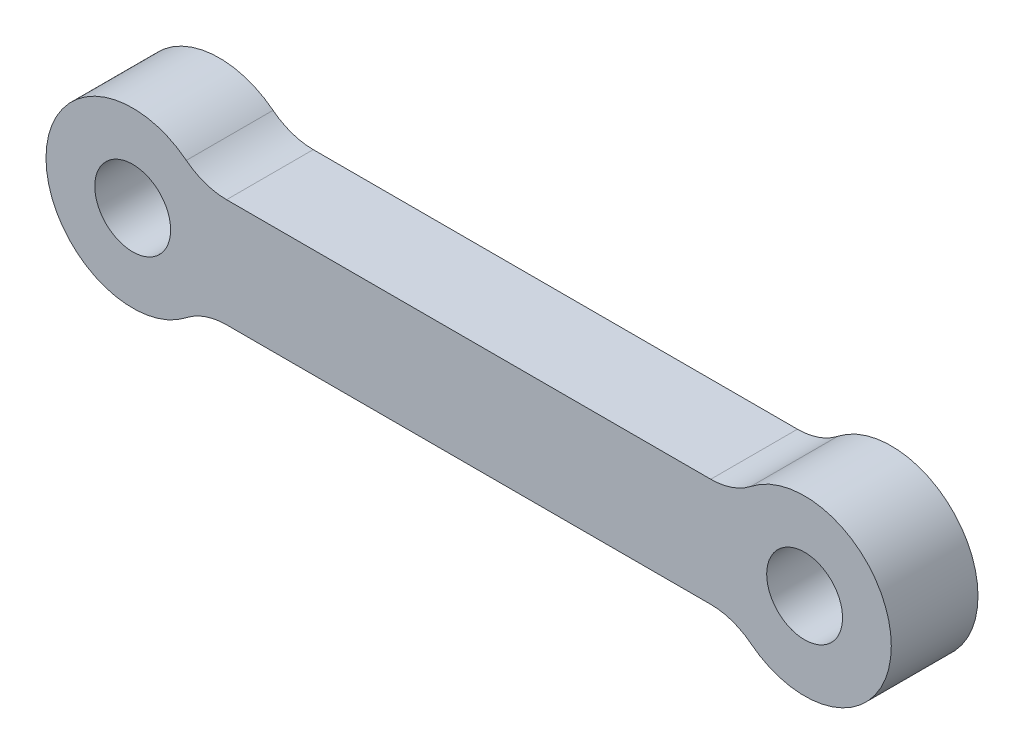
ISO-10303-21;
HEADER;
FILE_DESCRIPTION(('STEP AP214'),'2;1');
FILE_NAME('part.step','',(''),(''),'','','');
FILE_SCHEMA(('AUTOMOTIVE_DESIGN { 1 0 10303 214 1 1 1 1 }'));
ENDSEC;
DATA;
#1=APPLICATION_CONTEXT('core data for automotive mechanical design processes');
#2=APPLICATION_PROTOCOL_DEFINITION('international standard','automotive_design',2000,#1);
#3=PRODUCT_CONTEXT('',#1,'mechanical');
#4=PRODUCT('Part','Part','',(#3));
#5=PRODUCT_RELATED_PRODUCT_CATEGORY('part','',(#4));
#6=PRODUCT_DEFINITION_FORMATION('','',#4);
#7=PRODUCT_DEFINITION_CONTEXT('part definition',#1,'design');
#8=PRODUCT_DEFINITION('design','',#6,#7);
#9=PRODUCT_DEFINITION_SHAPE('','',#8);
#10=(LENGTH_UNIT() NAMED_UNIT(*) SI_UNIT(.MILLI.,.METRE.));
#11=(NAMED_UNIT(*) PLANE_ANGLE_UNIT() SI_UNIT($,.RADIAN.));
#12=(NAMED_UNIT(*) SI_UNIT($,.STERADIAN.) SOLID_ANGLE_UNIT());
#13=UNCERTAINTY_MEASURE_WITH_UNIT(LENGTH_MEASURE(1.E-05),#10,'distance_accuracy_value','');
#14=(GEOMETRIC_REPRESENTATION_CONTEXT(3) GLOBAL_UNCERTAINTY_ASSIGNED_CONTEXT((#13)) GLOBAL_UNIT_ASSIGNED_CONTEXT((#10,
#11,#12)) REPRESENTATION_CONTEXT('',''));
#15=CARTESIAN_POINT('',(0.,0.,0.));
#16=DIRECTION('',(0.,0.,1.));
#17=DIRECTION('',(1.,0.,0.));
#18=AXIS2_PLACEMENT_3D('',#15,#16,#17);
#19=CARTESIAN_POINT('',(31.,0.,4.));
#20=DIRECTION('',(0.,0.,-1.));
#21=DIRECTION('',(-1.,0.,0.));
#22=AXIS2_PLACEMENT_3D('',#19,#20,#21);
#23=PLANE('',#22);
#24=DIRECTION('',(1.,0.,0.));
#25=VECTOR('',#24,1.);
#26=CARTESIAN_POINT('',(27.8775047361113,-2.50000466539417,4.));
#27=LINE('',#26,#25);
#28=CARTESIAN_POINT('',(4.33012109306915,-2.50000466539417,4.));
#29=VERTEX_POINT('',#28);
#30=CARTESIAN_POINT('',(26.6698789069308,-2.50000466539417,4.));
#31=VERTEX_POINT('',#30);
#32=EDGE_CURVE('E136',#29,#31,#27,.T.);
#33=ORIENTED_EDGE('',*,*,#32,.T.);
#34=CARTESIAN_POINT('',(26.6698789069308,-5.50000466539417,4.));
#35=DIRECTION('',(0.,0.,-1.));
#36=DIRECTION('',(-1.,0.,0.));
#37=AXIS2_PLACEMENT_3D('',#34,#35,#36);
#38=CIRCLE('',#37,3.);
#39=CARTESIAN_POINT('',(28.5256450896748,-3.14285980879667,4.));
#40=VERTEX_POINT('',#39);
#41=EDGE_CURVE('E153',#31,#40,#38,.T.);
#42=ORIENTED_EDGE('',*,*,#41,.T.);
#43=CARTESIAN_POINT('',(31.,0.,4.));
#44=DIRECTION('',(0.,0.,1.));
#45=DIRECTION('',(-1.,0.,0.));
#46=AXIS2_PLACEMENT_3D('',#43,#44,#45);
#47=CIRCLE('',#46,4.);
#48=CARTESIAN_POINT('',(28.5256450896748,3.14285980879667,4.));
#49=VERTEX_POINT('',#48);
#50=EDGE_CURVE('E135',#40,#49,#47,.T.);
#51=ORIENTED_EDGE('',*,*,#50,.T.);
#52=CARTESIAN_POINT('',(26.6698789069308,5.50000466539417,4.));
#53=DIRECTION('',(0.,0.,-1.));
#54=DIRECTION('',(-1.,0.,0.));
#55=AXIS2_PLACEMENT_3D('',#52,#53,#54);
#56=CIRCLE('',#55,3.);
#57=CARTESIAN_POINT('',(26.6698789069308,2.50000466539417,4.));
#58=VERTEX_POINT('',#57);
#59=EDGE_CURVE('E109',#49,#58,#56,.T.);
#60=ORIENTED_EDGE('',*,*,#59,.T.);
#61=DIRECTION('',(-1.,0.,0.));
#62=VECTOR('',#61,1.);
#63=CARTESIAN_POINT('',(3.12249526388871,2.50000466539417,4.));
#64=LINE('',#63,#62);
#65=CARTESIAN_POINT('',(4.33012109306916,2.50000466539417,4.));
#66=VERTEX_POINT('',#65);
#67=EDGE_CURVE('E117',#58,#66,#64,.T.);
#68=ORIENTED_EDGE('',*,*,#67,.T.);
#69=CARTESIAN_POINT('',(4.33012109306916,5.50000466539417,4.));
#70=DIRECTION('',(0.,0.,-1.));
#71=DIRECTION('',(-1.,0.,0.));
#72=AXIS2_PLACEMENT_3D('',#69,#70,#71);
#73=CIRCLE('',#72,3.);
#74=CARTESIAN_POINT('',(2.47435491032523,3.14285980879667,4.));
#75=VERTEX_POINT('',#74);
#76=EDGE_CURVE('E11',#66,#75,#73,.T.);
#77=ORIENTED_EDGE('',*,*,#76,.T.);
#78=CARTESIAN_POINT('',(0.,0.,4.));
#79=DIRECTION('',(0.,0.,1.));
#80=DIRECTION('',(1.,0.,0.));
#81=AXIS2_PLACEMENT_3D('',#78,#79,#80);
#82=CIRCLE('',#81,4.);
#83=CARTESIAN_POINT('',(2.47435491032523,-3.14285980879667,4.));
#84=VERTEX_POINT('',#83);
#85=EDGE_CURVE('E163',#75,#84,#82,.T.);
#86=ORIENTED_EDGE('',*,*,#85,.T.);
#87=CARTESIAN_POINT('',(4.33012109306915,-5.50000466539417,4.));
#88=DIRECTION('',(0.,0.,-1.));
#89=DIRECTION('',(-1.,0.,0.));
#90=AXIS2_PLACEMENT_3D('',#87,#88,#89);
#91=CIRCLE('',#90,3.);
#92=EDGE_CURVE('E157',#84,#29,#91,.T.);
#93=ORIENTED_EDGE('',*,*,#92,.T.);
#94=EDGE_LOOP('',(#33,#42,#51,#60,#68,#77,#86,#93));
#95=FACE_BOUND('',#94,.T.);
#96=CARTESIAN_POINT('',(31.,0.,4.));
#97=DIRECTION('',(0.,0.,1.));
#98=DIRECTION('',(-1.,0.,0.));
#99=AXIS2_PLACEMENT_3D('',#96,#97,#98);
#100=CIRCLE('',#99,1.75000024917156);
#101=CARTESIAN_POINT('',(29.2499997508284,0.,4.));
#102=VERTEX_POINT('',#101);
#103=EDGE_CURVE('E129',#102,#102,#100,.T.);
#104=ORIENTED_EDGE('',*,*,#103,.F.);
#105=EDGE_LOOP('',(#104));
#106=FACE_BOUND('',#105,.T.);
#107=CARTESIAN_POINT('',(0.,0.,4.));
#108=DIRECTION('',(0.,0.,1.));
#109=DIRECTION('',(1.,0.,0.));
#110=AXIS2_PLACEMENT_3D('',#107,#108,#109);
#111=CIRCLE('',#110,1.75000024917156);
#112=CARTESIAN_POINT('',(1.75000024917156,0.,4.));
#113=VERTEX_POINT('',#112);
#114=EDGE_CURVE('E182',#113,#113,#111,.T.);
#115=ORIENTED_EDGE('',*,*,#114,.F.);
#116=EDGE_LOOP('',(#115));
#117=FACE_BOUND('',#116,.T.);
#118=ADVANCED_FACE('F34',(#95,#106,#117),#23,.F.);
#119=CARTESIAN_POINT('',(31.,0.,0.));
#120=DIRECTION('',(0.,0.,-1.));
#121=DIRECTION('',(-1.,0.,0.));
#122=AXIS2_PLACEMENT_3D('',#119,#120,#121);
#123=PLANE('',#122);
#124=CARTESIAN_POINT('',(31.,0.,0.));
#125=DIRECTION('',(0.,0.,1.));
#126=DIRECTION('',(-1.,0.,0.));
#127=AXIS2_PLACEMENT_3D('',#124,#125,#126);
#128=CIRCLE('',#127,1.75000024917156);
#129=CARTESIAN_POINT('',(29.2499997508284,0.,0.));
#130=VERTEX_POINT('',#129);
#131=EDGE_CURVE('E179',#130,#130,#128,.T.);
#132=ORIENTED_EDGE('',*,*,#131,.T.);
#133=EDGE_LOOP('',(#132));
#134=FACE_BOUND('',#133,.T.);
#135=CARTESIAN_POINT('',(31.,0.,0.));
#136=DIRECTION('',(0.,0.,1.));
#137=DIRECTION('',(-1.,0.,0.));
#138=AXIS2_PLACEMENT_3D('',#135,#136,#137);
#139=CIRCLE('',#138,4.);
#140=CARTESIAN_POINT('',(28.5256450896748,-3.14285980879667,0.));
#141=VERTEX_POINT('',#140);
#142=CARTESIAN_POINT('',(28.5256450896748,3.14285980879667,0.));
#143=VERTEX_POINT('',#142);
#144=EDGE_CURVE('E125',#141,#143,#139,.T.);
#145=ORIENTED_EDGE('',*,*,#144,.F.);
#146=CARTESIAN_POINT('',(26.6698789069308,-5.50000466539417,0.));
#147=DIRECTION('',(0.,0.,-1.));
#148=DIRECTION('',(-1.,0.,0.));
#149=AXIS2_PLACEMENT_3D('',#146,#147,#148);
#150=CIRCLE('',#149,3.);
#151=CARTESIAN_POINT('',(26.6698789069308,-2.50000466539417,0.));
#152=VERTEX_POINT('',#151);
#153=EDGE_CURVE('E151',#141,#152,#150,.F.);
#154=ORIENTED_EDGE('',*,*,#153,.T.);
#155=DIRECTION('',(1.,0.,0.));
#156=VECTOR('',#155,1.);
#157=CARTESIAN_POINT('',(27.8775047361113,-2.50000466539417,0.));
#158=LINE('',#157,#156);
#159=CARTESIAN_POINT('',(4.33012109306915,-2.50000466539417,0.));
#160=VERTEX_POINT('',#159);
#161=EDGE_CURVE('E127',#160,#152,#158,.T.);
#162=ORIENTED_EDGE('',*,*,#161,.F.);
#163=CARTESIAN_POINT('',(4.33012109306915,-5.50000466539417,0.));
#164=DIRECTION('',(0.,0.,-1.));
#165=DIRECTION('',(-1.,0.,0.));
#166=AXIS2_PLACEMENT_3D('',#163,#164,#165);
#167=CIRCLE('',#166,3.);
#168=CARTESIAN_POINT('',(2.47435491032523,-3.14285980879667,0.));
#169=VERTEX_POINT('',#168);
#170=EDGE_CURVE('E155',#160,#169,#167,.F.);
#171=ORIENTED_EDGE('',*,*,#170,.T.);
#172=CARTESIAN_POINT('',(0.,0.,0.));
#173=DIRECTION('',(0.,0.,1.));
#174=DIRECTION('',(1.,0.,0.));
#175=AXIS2_PLACEMENT_3D('',#172,#173,#174);
#176=CIRCLE('',#175,4.);
#177=CARTESIAN_POINT('',(2.47435491032523,3.14285980879667,0.));
#178=VERTEX_POINT('',#177);
#179=EDGE_CURVE('E124',#178,#169,#176,.T.);
#180=ORIENTED_EDGE('',*,*,#179,.F.);
#181=CARTESIAN_POINT('',(4.33012109306916,5.50000466539417,0.));
#182=DIRECTION('',(0.,0.,-1.));
#183=DIRECTION('',(-1.,0.,0.));
#184=AXIS2_PLACEMENT_3D('',#181,#182,#183);
#185=CIRCLE('',#184,3.);
#186=CARTESIAN_POINT('',(4.33012109306916,2.50000466539417,0.));
#187=VERTEX_POINT('',#186);
#188=EDGE_CURVE('E42',#178,#187,#185,.F.);
#189=ORIENTED_EDGE('',*,*,#188,.T.);
#190=DIRECTION('',(-1.,0.,0.));
#191=VECTOR('',#190,1.);
#192=CARTESIAN_POINT('',(3.12249526388871,2.50000466539417,0.));
#193=LINE('',#192,#191);
#194=CARTESIAN_POINT('',(26.6698789069308,2.50000466539417,0.));
#195=VERTEX_POINT('',#194);
#196=EDGE_CURVE('E115',#195,#187,#193,.T.);
#197=ORIENTED_EDGE('',*,*,#196,.F.);
#198=CARTESIAN_POINT('',(26.6698789069308,5.50000466539417,0.));
#199=DIRECTION('',(0.,0.,-1.));
#200=DIRECTION('',(-1.,0.,0.));
#201=AXIS2_PLACEMENT_3D('',#198,#199,#200);
#202=CIRCLE('',#201,3.);
#203=EDGE_CURVE('E99',#195,#143,#202,.F.);
#204=ORIENTED_EDGE('',*,*,#203,.T.);
#205=EDGE_LOOP('',(#145,#154,#162,#171,#180,#189,#197,#204));
#206=FACE_BOUND('',#205,.T.);
#207=CARTESIAN_POINT('',(0.,0.,0.));
#208=DIRECTION('',(0.,0.,1.));
#209=DIRECTION('',(1.,0.,0.));
#210=AXIS2_PLACEMENT_3D('',#207,#208,#209);
#211=CIRCLE('',#210,1.75000024917156);
#212=CARTESIAN_POINT('',(1.75000024917156,0.,0.));
#213=VERTEX_POINT('',#212);
#214=EDGE_CURVE('E185',#213,#213,#211,.T.);
#215=ORIENTED_EDGE('',*,*,#214,.T.);
#216=EDGE_LOOP('',(#215));
#217=FACE_BOUND('',#216,.T.);
#218=ADVANCED_FACE('F121',(#134,#206,#217),#123,.T.);
#219=CARTESIAN_POINT('',(31.,0.,4.));
#220=DIRECTION('',(0.,0.,-1.));
#221=DIRECTION('',(-1.,0.,0.));
#222=AXIS2_PLACEMENT_3D('',#219,#220,#221);
#223=CYLINDRICAL_SURFACE('',#222,4.);
#224=ORIENTED_EDGE('',*,*,#144,.T.);
#225=DIRECTION('',(0.,0.,-1.));
#226=VECTOR('',#225,1.);
#227=CARTESIAN_POINT('',(28.5256450896748,3.14285980879667,4.));
#228=LINE('',#227,#226);
#229=EDGE_CURVE('E104',#143,#49,#228,.F.);
#230=ORIENTED_EDGE('',*,*,#229,.T.);
#231=ORIENTED_EDGE('',*,*,#50,.F.);
#232=DIRECTION('',(0.,0.,-1.));
#233=VECTOR('',#232,1.);
#234=CARTESIAN_POINT('',(28.5256450896748,-3.14285980879667,4.));
#235=LINE('',#234,#233);
#236=EDGE_CURVE('E118',#40,#141,#235,.T.);
#237=ORIENTED_EDGE('',*,*,#236,.T.);
#238=EDGE_LOOP('',(#224,#230,#231,#237));
#239=FACE_BOUND('',#238,.T.);
#240=ADVANCED_FACE('F199',(#239),#223,.T.);
#241=CARTESIAN_POINT('',(3.12249526388871,2.50000466539417,4.));
#242=DIRECTION('',(0.,-1.,0.));
#243=DIRECTION('',(0.,0.,-1.));
#244=AXIS2_PLACEMENT_3D('',#241,#242,#243);
#245=PLANE('',#244);
#246=ORIENTED_EDGE('',*,*,#67,.F.);
#247=DIRECTION('',(0.,0.,1.));
#248=VECTOR('',#247,1.);
#249=CARTESIAN_POINT('',(26.6698789069308,2.50000466539417,0.));
#250=LINE('',#249,#248);
#251=EDGE_CURVE('E103',#58,#195,#250,.F.);
#252=ORIENTED_EDGE('',*,*,#251,.T.);
#253=ORIENTED_EDGE('',*,*,#196,.T.);
#254=DIRECTION('',(0.,0.,1.));
#255=VECTOR('',#254,1.);
#256=CARTESIAN_POINT('',(4.33012109306916,2.50000466539417,4.));
#257=LINE('',#256,#255);
#258=EDGE_CURVE('E119',#187,#66,#257,.T.);
#259=ORIENTED_EDGE('',*,*,#258,.T.);
#260=EDGE_LOOP('',(#246,#252,#253,#259));
#261=FACE_BOUND('',#260,.T.);
#262=ADVANCED_FACE('F114',(#261),#245,.F.);
#263=CARTESIAN_POINT('',(0.,0.,4.));
#264=DIRECTION('',(0.,0.,-1.));
#265=DIRECTION('',(-1.,0.,0.));
#266=AXIS2_PLACEMENT_3D('',#263,#264,#265);
#267=CYLINDRICAL_SURFACE('',#266,4.);
#268=ORIENTED_EDGE('',*,*,#179,.T.);
#269=DIRECTION('',(0.,0.,-1.));
#270=VECTOR('',#269,1.);
#271=CARTESIAN_POINT('',(2.47435491032523,-3.14285980879667,4.));
#272=LINE('',#271,#270);
#273=EDGE_CURVE('E49',#169,#84,#272,.F.);
#274=ORIENTED_EDGE('',*,*,#273,.T.);
#275=ORIENTED_EDGE('',*,*,#85,.F.);
#276=DIRECTION('',(0.,0.,-1.));
#277=VECTOR('',#276,1.);
#278=CARTESIAN_POINT('',(2.47435491032523,3.14285980879667,4.));
#279=LINE('',#278,#277);
#280=EDGE_CURVE('E146',#75,#178,#279,.T.);
#281=ORIENTED_EDGE('',*,*,#280,.T.);
#282=EDGE_LOOP('',(#268,#274,#275,#281));
#283=FACE_BOUND('',#282,.T.);
#284=ADVANCED_FACE('F171',(#283),#267,.T.);
#285=CARTESIAN_POINT('',(27.8775047361113,-2.50000466539417,4.));
#286=DIRECTION('',(0.,1.,0.));
#287=DIRECTION('',(0.,0.,1.));
#288=AXIS2_PLACEMENT_3D('',#285,#286,#287);
#289=PLANE('',#288);
#290=ORIENTED_EDGE('',*,*,#161,.T.);
#291=DIRECTION('',(0.,0.,1.));
#292=VECTOR('',#291,1.);
#293=CARTESIAN_POINT('',(26.6698789069308,-2.50000466539417,4.));
#294=LINE('',#293,#292);
#295=EDGE_CURVE('E144',#152,#31,#294,.T.);
#296=ORIENTED_EDGE('',*,*,#295,.T.);
#297=ORIENTED_EDGE('',*,*,#32,.F.);
#298=DIRECTION('',(0.,0.,1.));
#299=VECTOR('',#298,1.);
#300=CARTESIAN_POINT('',(4.33012109306915,-2.50000466539417,0.));
#301=LINE('',#300,#299);
#302=EDGE_CURVE('E141',#29,#160,#301,.F.);
#303=ORIENTED_EDGE('',*,*,#302,.T.);
#304=EDGE_LOOP('',(#290,#296,#297,#303));
#305=FACE_BOUND('',#304,.T.);
#306=ADVANCED_FACE('F167',(#305),#289,.F.);
#307=CARTESIAN_POINT('',(31.,0.,4.));
#308=DIRECTION('',(0.,0.,-1.));
#309=DIRECTION('',(-1.,0.,0.));
#310=AXIS2_PLACEMENT_3D('',#307,#308,#309);
#311=CYLINDRICAL_SURFACE('',#310,1.75000024917156);
#312=ORIENTED_EDGE('',*,*,#103,.T.);
#313=EDGE_LOOP('',(#312));
#314=FACE_BOUND('',#313,.T.);
#315=ORIENTED_EDGE('',*,*,#131,.F.);
#316=EDGE_LOOP('',(#315));
#317=FACE_BOUND('',#316,.T.);
#318=ADVANCED_FACE('F203',(#314,#317),#311,.F.);
#319=CARTESIAN_POINT('',(0.,0.,4.));
#320=DIRECTION('',(0.,0.,-1.));
#321=DIRECTION('',(-1.,0.,0.));
#322=AXIS2_PLACEMENT_3D('',#319,#320,#321);
#323=CYLINDRICAL_SURFACE('',#322,1.75000024917156);
#324=ORIENTED_EDGE('',*,*,#114,.T.);
#325=EDGE_LOOP('',(#324));
#326=FACE_BOUND('',#325,.T.);
#327=ORIENTED_EDGE('',*,*,#214,.F.);
#328=EDGE_LOOP('',(#327));
#329=FACE_BOUND('',#328,.T.);
#330=ADVANCED_FACE('F191',(#326,#329),#323,.F.);
#331=CARTESIAN_POINT('',(26.6698789069308,5.50000466539417,4.));
#332=DIRECTION('',(0.,0.,-1.));
#333=DIRECTION('',(-1.,0.,0.));
#334=AXIS2_PLACEMENT_3D('',#331,#332,#333);
#335=CYLINDRICAL_SURFACE('',#334,3.);
#336=ORIENTED_EDGE('',*,*,#59,.F.);
#337=ORIENTED_EDGE('',*,*,#229,.F.);
#338=ORIENTED_EDGE('',*,*,#203,.F.);
#339=ORIENTED_EDGE('',*,*,#251,.F.);
#340=EDGE_LOOP('',(#336,#337,#338,#339));
#341=FACE_BOUND('',#340,.T.);
#342=ADVANCED_FACE('F102',(#341),#335,.F.);
#343=CARTESIAN_POINT('',(26.6698789069308,-5.50000466539417,4.));
#344=DIRECTION('',(0.,0.,-1.));
#345=DIRECTION('',(-1.,0.,0.));
#346=AXIS2_PLACEMENT_3D('',#343,#344,#345);
#347=CYLINDRICAL_SURFACE('',#346,3.);
#348=ORIENTED_EDGE('',*,*,#41,.F.);
#349=ORIENTED_EDGE('',*,*,#295,.F.);
#350=ORIENTED_EDGE('',*,*,#153,.F.);
#351=ORIENTED_EDGE('',*,*,#236,.F.);
#352=EDGE_LOOP('',(#348,#349,#350,#351));
#353=FACE_BOUND('',#352,.T.);
#354=ADVANCED_FACE('F217',(#353),#347,.F.);
#355=CARTESIAN_POINT('',(4.33012109306915,-5.50000466539417,4.));
#356=DIRECTION('',(0.,0.,-1.));
#357=DIRECTION('',(-1.,0.,0.));
#358=AXIS2_PLACEMENT_3D('',#355,#356,#357);
#359=CYLINDRICAL_SURFACE('',#358,3.);
#360=ORIENTED_EDGE('',*,*,#92,.F.);
#361=ORIENTED_EDGE('',*,*,#273,.F.);
#362=ORIENTED_EDGE('',*,*,#170,.F.);
#363=ORIENTED_EDGE('',*,*,#302,.F.);
#364=EDGE_LOOP('',(#360,#361,#362,#363));
#365=FACE_BOUND('',#364,.T.);
#366=ADVANCED_FACE('F170',(#365),#359,.F.);
#367=CARTESIAN_POINT('',(4.33012109306916,5.50000466539417,4.));
#368=DIRECTION('',(0.,0.,-1.));
#369=DIRECTION('',(-1.,0.,0.));
#370=AXIS2_PLACEMENT_3D('',#367,#368,#369);
#371=CYLINDRICAL_SURFACE('',#370,3.);
#372=ORIENTED_EDGE('',*,*,#76,.F.);
#373=ORIENTED_EDGE('',*,*,#258,.F.);
#374=ORIENTED_EDGE('',*,*,#188,.F.);
#375=ORIENTED_EDGE('',*,*,#280,.F.);
#376=EDGE_LOOP('',(#372,#373,#374,#375));
#377=FACE_BOUND('',#376,.T.);
#378=ADVANCED_FACE('F36',(#377),#371,.F.);
#379=CLOSED_SHELL('',(#118,#218,#240,#262,#284,#306,#318,#330,#342,#354,#366,#378));
#380=MANIFOLD_SOLID_BREP('B2',#379);
#381=ADVANCED_BREP_SHAPE_REPRESENTATION('',(#18,#380),#14);
#382=SHAPE_DEFINITION_REPRESENTATION(#9,#381);
ENDSEC;
END-ISO-10303-21;
